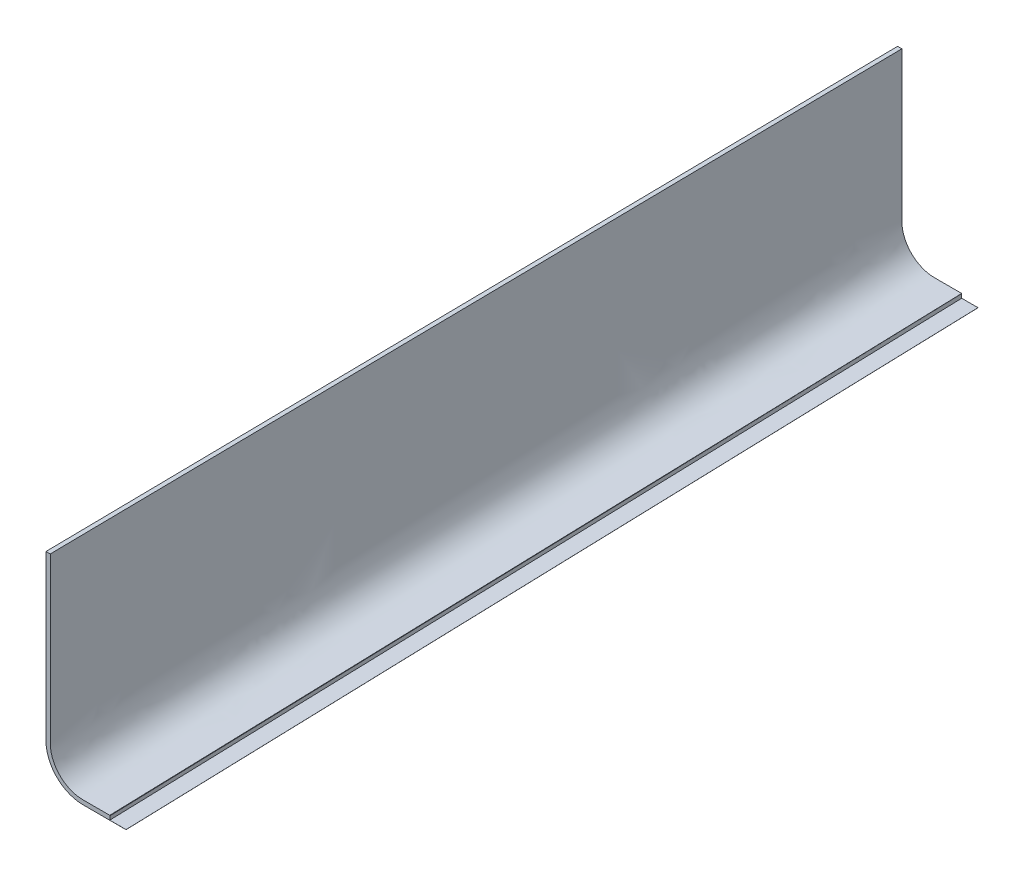
ISO-10303-21;
HEADER;
FILE_DESCRIPTION(('STEP AP214'),'2;1');
FILE_NAME('part.step','',(''),(''),'','','');
FILE_SCHEMA(('AUTOMOTIVE_DESIGN { 1 0 10303 214 1 1 1 1 }'));
ENDSEC;
DATA;
#1=APPLICATION_CONTEXT('core data for automotive mechanical design processes');
#2=APPLICATION_PROTOCOL_DEFINITION('international standard','automotive_design',2000,#1);
#3=PRODUCT_CONTEXT('',#1,'mechanical');
#4=PRODUCT('Part','Part','',(#3));
#5=PRODUCT_RELATED_PRODUCT_CATEGORY('part','',(#4));
#6=PRODUCT_DEFINITION_FORMATION('','',#4);
#7=PRODUCT_DEFINITION_CONTEXT('part definition',#1,'design');
#8=PRODUCT_DEFINITION('design','',#6,#7);
#9=PRODUCT_DEFINITION_SHAPE('','',#8);
#10=(LENGTH_UNIT() NAMED_UNIT(*) SI_UNIT(.MILLI.,.METRE.));
#11=(NAMED_UNIT(*) PLANE_ANGLE_UNIT() SI_UNIT($,.RADIAN.));
#12=(NAMED_UNIT(*) SI_UNIT($,.STERADIAN.) SOLID_ANGLE_UNIT());
#13=UNCERTAINTY_MEASURE_WITH_UNIT(LENGTH_MEASURE(1.E-05),#10,'distance_accuracy_value','');
#14=(GEOMETRIC_REPRESENTATION_CONTEXT(3) GLOBAL_UNCERTAINTY_ASSIGNED_CONTEXT((#13)) GLOBAL_UNIT_ASSIGNED_CONTEXT((#10,
#11,#12)) REPRESENTATION_CONTEXT('',''));
#15=CARTESIAN_POINT('',(0.,0.,0.));
#16=DIRECTION('',(0.,0.,1.));
#17=DIRECTION('',(1.,0.,0.));
#18=AXIS2_PLACEMENT_3D('',#15,#16,#17);
#19=CARTESIAN_POINT('',(-445.153479576773,-230.782639429531,-2052.91158045471));
#20=DIRECTION('',(0.,0.,-1.));
#21=DIRECTION('',(-1.,0.,0.));
#22=AXIS2_PLACEMENT_3D('',#19,#20,#21);
#23=PLANE('',#22);
#24=DIRECTION('',(-1.,0.,0.));
#25=VECTOR('',#24,1.);
#26=CARTESIAN_POINT('',(-521.353479576773,118.467360570469,-2052.91158045471));
#27=LINE('',#26,#25);
#28=CARTESIAN_POINT('',(-521.353479576773,118.467360570469,-2052.91158045471));
#29=VERTEX_POINT('',#28);
#30=CARTESIAN_POINT('',(-531.353479576773,118.467360570469,-2052.91158045471));
#31=VERTEX_POINT('',#30);
#32=EDGE_CURVE('E372',#29,#31,#27,.T.);
#33=ORIENTED_EDGE('',*,*,#32,.F.);
#34=DIRECTION('',(0.,-1.,0.));
#35=VECTOR('',#34,1.);
#36=CARTESIAN_POINT('',(-521.353479576773,118.467360570469,-2052.91158045471));
#37=LINE('',#36,#35);
#38=CARTESIAN_POINT('',(-521.353479576773,-230.782639429531,-2052.91158045471));
#39=VERTEX_POINT('',#38);
#40=EDGE_CURVE('E13',#29,#39,#37,.T.);
#41=ORIENTED_EDGE('',*,*,#40,.T.);
#42=CARTESIAN_POINT('',(-445.153479576773,-230.782639429531,-2052.91158045471));
#43=DIRECTION('',(0.,0.,-1.));
#44=DIRECTION('',(-1.,0.,0.));
#45=AXIS2_PLACEMENT_3D('',#42,#43,#44);
#46=CIRCLE('',#45,76.2);
#47=CARTESIAN_POINT('',(-445.153479576773,-306.982639429531,-2052.91158045471));
#48=VERTEX_POINT('',#47);
#49=EDGE_CURVE('E280',#48,#39,#46,.T.);
#50=ORIENTED_EDGE('',*,*,#49,.F.);
#51=DIRECTION('',(1.,0.,0.));
#52=VECTOR('',#51,1.);
#53=CARTESIAN_POINT('',(-445.153479576773,-306.982639429531,-2052.91158045471));
#54=LINE('',#53,#52);
#55=CARTESIAN_POINT('',(-381.356191574078,-306.982639429531,-2052.91158045471));
#56=VERTEX_POINT('',#55);
#57=EDGE_CURVE('E730',#48,#56,#54,.T.);
#58=ORIENTED_EDGE('',*,*,#57,.T.);
#59=DIRECTION('',(0.,1.,0.));
#60=VECTOR('',#59,1.);
#61=CARTESIAN_POINT('',(-381.356191574078,-316.782639429531,-2052.91158045471));
#62=LINE('',#61,#60);
#63=CARTESIAN_POINT('',(-381.356191574078,-307.844992886495,-2052.91158045471));
#64=VERTEX_POINT('',#63);
#65=EDGE_CURVE('E586',#64,#56,#62,.T.);
#66=ORIENTED_EDGE('',*,*,#65,.F.);
#67=CARTESIAN_POINT('',(-381.356191574078,-316.782639429531,-2052.91158045471));
#68=VERTEX_POINT('',#67);
#69=EDGE_CURVE('E727',#68,#64,#62,.T.);
#70=ORIENTED_EDGE('',*,*,#69,.F.);
#71=DIRECTION('',(-1.,0.,0.));
#72=VECTOR('',#71,1.);
#73=CARTESIAN_POINT('',(-343.256191574078,-316.782639429531,-2052.91158045471));
#74=LINE('',#73,#72);
#75=CARTESIAN_POINT('',(-343.256191574078,-316.782639429531,-2052.91158045471));
#76=VERTEX_POINT('',#75);
#77=EDGE_CURVE('E722',#76,#68,#74,.T.);
#78=ORIENTED_EDGE('',*,*,#77,.F.);
#79=DIRECTION('',(2.7755575615632E-13,1.,0.));
#80=VECTOR('',#79,1.);
#81=CARTESIAN_POINT('',(-343.256191574078,-316.982639429531,-2052.91158045471));
#82=LINE('',#81,#80);
#83=CARTESIAN_POINT('',(-343.256191574078,-316.982639429531,-2052.91158045471));
#84=VERTEX_POINT('',#83);
#85=EDGE_CURVE('E725',#84,#76,#82,.T.);
#86=ORIENTED_EDGE('',*,*,#85,.F.);
#87=DIRECTION('',(1.,0.,0.));
#88=VECTOR('',#87,1.);
#89=CARTESIAN_POINT('',(-364.070454388012,-316.982639429531,-2052.91158045471));
#90=LINE('',#89,#88);
#91=CARTESIAN_POINT('',(-364.070454388012,-316.982639429531,-2052.91158045471));
#92=VERTEX_POINT('',#91);
#93=EDGE_CURVE('E761',#92,#84,#90,.T.);
#94=ORIENTED_EDGE('',*,*,#93,.F.);
#95=DIRECTION('',(1.,0.,0.));
#96=VECTOR('',#95,1.);
#97=CARTESIAN_POINT('',(-445.153479576773,-316.982639429531,-2052.91158045471));
#98=LINE('',#97,#96);
#99=CARTESIAN_POINT('',(-445.153479576773,-316.982639429531,-2052.91158045471));
#100=VERTEX_POINT('',#99);
#101=EDGE_CURVE('E778',#100,#92,#98,.T.);
#102=ORIENTED_EDGE('',*,*,#101,.F.);
#103=CARTESIAN_POINT('',(-445.153479576773,-230.782639429531,-2052.91158045471));
#104=DIRECTION('',(0.,0.,-1.));
#105=DIRECTION('',(-1.,0.,0.));
#106=AXIS2_PLACEMENT_3D('',#103,#104,#105);
#107=CIRCLE('',#106,86.2);
#108=CARTESIAN_POINT('',(-531.353479576773,-230.782639429531,-2052.91158045471));
#109=VERTEX_POINT('',#108);
#110=EDGE_CURVE('E781',#100,#109,#107,.T.);
#111=ORIENTED_EDGE('',*,*,#110,.T.);
#112=DIRECTION('',(0.,-1.,0.));
#113=VECTOR('',#112,1.);
#114=CARTESIAN_POINT('',(-531.353479576773,118.467360570469,-2052.91158045471));
#115=LINE('',#114,#113);
#116=EDGE_CURVE('E574',#31,#109,#115,.T.);
#117=ORIENTED_EDGE('',*,*,#116,.F.);
#118=EDGE_LOOP('',(#33,#41,#50,#58,#66,#70,#78,#86,#94,#102,#111,#117));
#119=FACE_BOUND('',#118,.T.);
#120=ADVANCED_FACE('F269',(#119),#23,.T.);
#121=CARTESIAN_POINT('',(-383.521789204399,-230.782639429518,0.));
#122=DIRECTION('',(0.,0.,1.));
#123=DIRECTION('',(1.,0.,0.));
#124=AXIS2_PLACEMENT_3D('',#121,#122,#123);
#125=PLANE('',#124);
#126=DIRECTION('',(0.,-1.,0.));
#127=VECTOR('',#126,1.);
#128=CARTESIAN_POINT('',(-469.721789204399,152.757360570421,0.));
#129=LINE('',#128,#127);
#130=CARTESIAN_POINT('',(-469.721789204399,152.757360570421,0.));
#131=VERTEX_POINT('',#130);
#132=CARTESIAN_POINT('',(-469.721789204399,142.757360569809,0.));
#133=VERTEX_POINT('',#132);
#134=EDGE_CURVE('E490',#131,#133,#129,.T.);
#135=ORIENTED_EDGE('',*,*,#134,.T.);
#136=DIRECTION('',(0.,-1.,0.));
#137=VECTOR('',#136,1.);
#138=CARTESIAN_POINT('',(-469.721789204399,142.757360570421,0.));
#139=LINE('',#138,#137);
#140=CARTESIAN_POINT('',(-469.721789204399,-230.782639429505,0.));
#141=VERTEX_POINT('',#140);
#142=EDGE_CURVE('E482',#133,#141,#139,.T.);
#143=ORIENTED_EDGE('',*,*,#142,.T.);
#144=CARTESIAN_POINT('',(-383.521789204399,-230.782639429518,0.));
#145=DIRECTION('',(0.,0.,1.));
#146=DIRECTION('',(1.,0.,0.));
#147=AXIS2_PLACEMENT_3D('',#144,#145,#146);
#148=CIRCLE('',#147,86.2);
#149=CARTESIAN_POINT('',(-383.521794947628,-316.988202016457,0.));
#150=VERTEX_POINT('',#149);
#151=EDGE_CURVE('E489',#141,#150,#148,.T.);
#152=ORIENTED_EDGE('',*,*,#151,.T.);
#153=DIRECTION('',(0.999998000005999,-0.00199999600055312,0.));
#154=VECTOR('',#153,1.);
#155=CARTESIAN_POINT('',(-383.521789204399,-316.982639429518,0.));
#156=LINE('',#155,#154);
#157=CARTESIAN_POINT('',(-320.627654741503,-317.104976295081,0.));
#158=VERTEX_POINT('',#157);
#159=EDGE_CURVE('E494',#150,#158,#156,.T.);
#160=ORIENTED_EDGE('',*,*,#159,.T.);
#161=DIRECTION('',(-1.,0.,0.));
#162=VECTOR('',#161,1.);
#163=CARTESIAN_POINT('',(-282.527675027662,-317.108427688626,0.));
#164=LINE('',#163,#162);
#165=CARTESIAN_POINT('',(-282.527675027662,-317.108427688626,0.));
#166=VERTEX_POINT('',#165);
#167=EDGE_CURVE('E670',#166,#158,#164,.T.);
#168=ORIENTED_EDGE('',*,*,#167,.F.);
#169=DIRECTION('',(0.,1.,0.));
#170=VECTOR('',#169,1.);
#171=CARTESIAN_POINT('',(-282.527675027662,-317.108427688626,0.));
#172=LINE('',#171,#170);
#173=CARTESIAN_POINT('',(-282.527675027662,-316.908427688626,0.));
#174=VERTEX_POINT('',#173);
#175=EDGE_CURVE('E673',#166,#174,#172,.T.);
#176=ORIENTED_EDGE('',*,*,#175,.T.);
#177=DIRECTION('',(-1.,0.,0.));
#178=VECTOR('',#177,1.);
#179=CARTESIAN_POINT('',(-282.527675027662,-316.908427688626,0.));
#180=LINE('',#179,#178);
#181=CARTESIAN_POINT('',(-320.627659667512,-316.908427688626,0.));
#182=VERTEX_POINT('',#181);
#183=EDGE_CURVE('E674',#174,#182,#180,.T.);
#184=ORIENTED_EDGE('',*,*,#183,.T.);
#185=DIRECTION('',(-0.0652485640375134,-0.997869041954425,0.));
#186=VECTOR('',#185,1.);
#187=CARTESIAN_POINT('',(-320.021789204393,-307.642639429531,0.));
#188=LINE('',#187,#186);
#189=CARTESIAN_POINT('',(-320.021789204393,-307.642639429531,0.));
#190=VERTEX_POINT('',#189);
#191=EDGE_CURVE('E632',#190,#182,#188,.T.);
#192=ORIENTED_EDGE('',*,*,#191,.F.);
#193=DIRECTION('',(-0.676252409146983,0.73666999336399,0.));
#194=VECTOR('',#193,1.);
#195=CARTESIAN_POINT('',(-320.021789204393,-307.642639429531,0.));
#196=LINE('',#195,#194);
#197=CARTESIAN_POINT('',(-320.627659667512,-306.982639429518,0.));
#198=VERTEX_POINT('',#197);
#199=EDGE_CURVE('E930',#190,#198,#196,.T.);
#200=ORIENTED_EDGE('',*,*,#199,.T.);
#201=DIRECTION('',(1.,0.,0.));
#202=VECTOR('',#201,1.);
#203=CARTESIAN_POINT('',(-383.521789204399,-306.982639429518,0.));
#204=LINE('',#203,#202);
#205=CARTESIAN_POINT('',(-383.521789204479,-306.982639429518,0.));
#206=VERTEX_POINT('',#205);
#207=EDGE_CURVE('E879',#206,#198,#204,.T.);
#208=ORIENTED_EDGE('',*,*,#207,.F.);
#209=CARTESIAN_POINT('',(-383.521789204399,-230.782639429518,0.));
#210=DIRECTION('',(0.,0.,1.));
#211=DIRECTION('',(1.,0.,0.));
#212=AXIS2_PLACEMENT_3D('',#209,#210,#211);
#213=CIRCLE('',#212,76.2000000000001);
#214=CARTESIAN_POINT('',(-459.721789204399,-230.782639429514,0.));
#215=VERTEX_POINT('',#214);
#216=EDGE_CURVE('E391',#215,#206,#213,.T.);
#217=ORIENTED_EDGE('',*,*,#216,.F.);
#218=DIRECTION('',(0.,-1.,0.));
#219=VECTOR('',#218,1.);
#220=CARTESIAN_POINT('',(-459.721789204399,152.757360570421,0.));
#221=LINE('',#220,#219);
#222=CARTESIAN_POINT('',(-459.721789204399,152.757360570421,0.));
#223=VERTEX_POINT('',#222);
#224=EDGE_CURVE('E366',#223,#215,#221,.T.);
#225=ORIENTED_EDGE('',*,*,#224,.F.);
#226=DIRECTION('',(-1.,0.,0.));
#227=VECTOR('',#226,1.);
#228=CARTESIAN_POINT('',(-459.721789204399,152.757360570421,0.));
#229=LINE('',#228,#227);
#230=EDGE_CURVE('E376',#223,#131,#229,.T.);
#231=ORIENTED_EDGE('',*,*,#230,.T.);
#232=EDGE_LOOP('',(#135,#143,#152,#160,#168,#176,#184,#192,#200,#208,#217,#225,#231));
#233=FACE_BOUND('',#232,.T.);
#234=ADVANCED_FACE('F389',(#233),#125,.T.);
#235=CARTESIAN_POINT('',(-469.721789204399,152.757360570421,0.));
#236=DIRECTION('',(0.,0.99986053230512,-0.0167007765843963));
#237=DIRECTION('',(1.,0.,0.));
#238=AXIS2_PLACEMENT_3D('',#235,#236,#237);
#239=PLANE('',#238);
#240=ORIENTED_EDGE('',*,*,#230,.F.);
#241=CARTESIAN_POINT('',(-459.721789204399,152.757360570421,0.));
#242=CARTESIAN_POINT('',(-480.26568599519,141.327360570437,-684.303860151571));
#243=CARTESIAN_POINT('',(-500.809582785982,129.897360570453,-1368.60772030314));
#244=CARTESIAN_POINT('',(-521.353479576773,118.467360570469,-2052.91158045471));
#245=B_SPLINE_CURVE_WITH_KNOTS('',3,(#241,#242,#243,#244),.UNSPECIFIED.,.F.,.F.,(4,4),(0.,1.),.UNSPECIFIED.);
#246=EDGE_CURVE('E296',#223,#29,#245,.T.);
#247=ORIENTED_EDGE('',*,*,#246,.T.);
#248=ORIENTED_EDGE('',*,*,#32,.T.);
#249=CARTESIAN_POINT('',(-469.721789204399,152.757360570421,0.));
#250=CARTESIAN_POINT('',(-490.26568599519,141.327360570437,-684.303860151571));
#251=CARTESIAN_POINT('',(-510.809582785982,129.897360570453,-1368.60772030314));
#252=CARTESIAN_POINT('',(-531.353479576773,118.467360570469,-2052.91158045471));
#253=B_SPLINE_CURVE_WITH_KNOTS('',3,(#249,#250,#251,#252),.UNSPECIFIED.,.F.,.F.,(4,4),(0.,1.),.UNSPECIFIED.);
#254=EDGE_CURVE('E373',#131,#31,#253,.T.);
#255=ORIENTED_EDGE('',*,*,#254,.F.);
#256=EDGE_LOOP('',(#240,#247,#248,#255));
#257=FACE_BOUND('',#256,.T.);
#258=ADVANCED_FACE('F378',(#257),#239,.T.);
#259=CARTESIAN_POINT('',(-282.527675027662,-317.108427688626,0.));
#260=CARTESIAN_POINT('',(-302.770513876468,-317.066498268928,-684.303860151571));
#261=CARTESIAN_POINT('',(-323.013352725273,-317.024568849229,-1368.60772030314));
#262=CARTESIAN_POINT('',(-343.256191574078,-316.982639429531,-2052.91158045471));
#263=CARTESIAN_POINT('',(-285.697641302843,-317.108427688626,0.));
#264=CARTESIAN_POINT('',(-305.463585658995,-317.066498268927,-684.303860151571));
#265=CARTESIAN_POINT('',(-325.229530015147,-317.024568849229,-1368.60772030314));
#266=CARTESIAN_POINT('',(-344.9954743713,-316.982639429531,-2052.91158045471));
#267=CARTESIAN_POINT('',(-292.576849740251,-317.108427688626,0.));
#268=CARTESIAN_POINT('',(-311.131651829535,-317.066498268928,-684.303860151572));
#269=CARTESIAN_POINT('',(-329.686453918819,-317.024568849229,-1368.60772030314));
#270=CARTESIAN_POINT('',(-348.241256008104,-316.982639429531,-2052.91158045472));
#271=CARTESIAN_POINT('',(-303.369400639009,-317.108427688626,0.));
#272=CARTESIAN_POINT('',(-319.884841536408,-317.066498268928,-684.30386015157));
#273=CARTESIAN_POINT('',(-336.400282433806,-317.024568849229,-1368.60772030314));
#274=CARTESIAN_POINT('',(-352.915723331205,-316.982639429531,-2052.91158045471));
#275=CARTESIAN_POINT('',(-312.916905601412,-317.108427688626,0.));
#276=CARTESIAN_POINT('',(-327.905516792665,-317.066498268928,-684.303860151573));
#277=CARTESIAN_POINT('',(-342.894127983917,-317.024568849229,-1368.60772030315));
#278=CARTESIAN_POINT('',(-357.882739175169,-316.982639429531,-2052.91158045472));
#279=CARTESIAN_POINT('',(-318.204006148451,-317.108427688626,0.));
#280=CARTESIAN_POINT('',(-332.677713958313,-317.066498268928,-684.303860151571));
#281=CARTESIAN_POINT('',(-347.151421768176,-317.024568849229,-1368.60772030314));
#282=CARTESIAN_POINT('',(-361.625129578038,-316.982639429531,-2052.91158045471));
#283=CARTESIAN_POINT('',(-326.62018082716,-317.096442646303,0.));
#284=CARTESIAN_POINT('',(-341.11897729975,-317.058508240712,-684.303860151571));
#285=CARTESIAN_POINT('',(-355.617773772339,-317.020573835122,-1368.60772030314));
#286=CARTESIAN_POINT('',(-370.116570244929,-316.982639429531,-2052.91158045471));
#287=CARTESIAN_POINT('',(-337.385924064454,-317.074911159823,0.));
#288=CARTESIAN_POINT('',(-352.58486759045,-317.044153916393,-684.303860151571));
#289=CARTESIAN_POINT('',(-367.783811116446,-317.013396672962,-1368.60772030314));
#290=CARTESIAN_POINT('',(-382.982754642442,-316.982639429531,-2052.91158045471));
#291=CARTESIAN_POINT('',(-352.369882640405,-317.044943242663,0.));
#292=CARTESIAN_POINT('',(-369.621517711926,-317.024175304952,-684.303860151571));
#293=CARTESIAN_POINT('',(-386.873152783447,-317.003407367241,-1368.60772030314));
#294=CARTESIAN_POINT('',(-404.124787854967,-316.982639429531,-2052.91158045471));
#295=CARTESIAN_POINT('',(-367.243954903688,-317.015195098129,0.));
#296=CARTESIAN_POINT('',(-386.684687497904,-317.004343208596,-684.303860151571));
#297=CARTESIAN_POINT('',(-406.125420092119,-316.993491319063,-1368.60772030314));
#298=CARTESIAN_POINT('',(-425.566152686335,-316.982639429531,-2052.91158045471));
#299=CARTESIAN_POINT('',(-377.772711680761,-316.994137584569,0.));
#300=CARTESIAN_POINT('',(-398.140826369264,-316.990304866223,-684.303860151571));
#301=CARTESIAN_POINT('',(-418.508941057767,-316.986472147877,-1368.60772030314));
#302=CARTESIAN_POINT('',(-438.87705574627,-316.982639429531,-2052.91158045471));
#303=CARTESIAN_POINT('',(-388.909615437399,-316.982639429518,0.));
#304=CARTESIAN_POINT('',(-409.618244895995,-316.982639429522,-684.303860151571));
#305=CARTESIAN_POINT('',(-430.326874354591,-316.982639429527,-1368.60772030314));
#306=CARTESIAN_POINT('',(-451.035503813186,-316.982639429531,-2052.91158045471));
#307=CARTESIAN_POINT('',(-399.760775558192,-315.96946035865,0.));
#308=CARTESIAN_POINT('',(-420.747864585682,-315.904732703993,-684.30386015157));
#309=CARTESIAN_POINT('',(-441.734953613172,-315.840005049336,-1368.60772030314));
#310=CARTESIAN_POINT('',(-462.722042640662,-315.77527739468,-2052.91158045471));
#311=CARTESIAN_POINT('',(-415.665679093124,-311.340510534376,0.));
#312=CARTESIAN_POINT('',(-436.887197428043,-311.075246025188,-684.303860151573));
#313=CARTESIAN_POINT('',(-458.108715762962,-310.809981516,-1368.60772030315));
#314=CARTESIAN_POINT('',(-479.330234097881,-310.544717006813,-2052.91158045472));
#315=CARTESIAN_POINT('',(-430.573694034692,-303.660229241234,0.));
#316=CARTESIAN_POINT('',(-451.849796552725,-303.17842871892,-684.303860151569));
#317=CARTESIAN_POINT('',(-473.125899070759,-302.696628196607,-1368.60772030314));
#318=CARTESIAN_POINT('',(-494.402001588792,-302.214827674294,-2052.91158045471));
#319=CARTESIAN_POINT('',(-443.863702089116,-293.120026681974,0.));
#320=CARTESIAN_POINT('',(-465.045919631966,-292.479753700611,-684.303860151573));
#321=CARTESIAN_POINT('',(-486.228137174817,-291.839480719248,-1368.60772030315));
#322=CARTESIAN_POINT('',(-507.410354717667,-291.199207737884,-2052.91158045472));
#323=CARTESIAN_POINT('',(-454.949248486127,-280.048650099816,0.));
#324=CARTESIAN_POINT('',(-475.942112838937,-279.361559815593,-684.303860151569));
#325=CARTESIAN_POINT('',(-496.934977191746,-278.67446953137,-1368.60772030314));
#326=CARTESIAN_POINT('',(-517.927841544555,-277.987379247147,-2052.91158045471));
#327=CARTESIAN_POINT('',(-463.311236697098,-264.90544229162,0.));
#328=CARTESIAN_POINT('',(-484.085148088738,-264.31134710688,-684.303860151573));
#329=CARTESIAN_POINT('',(-504.859059480378,-263.71725192214,-1368.60772030315));
#330=CARTESIAN_POINT('',(-525.632970872018,-263.1231567374,-2052.91158045472));
#331=CARTESIAN_POINT('',(-468.531236821943,-248.266005012165,0.));
#332=CARTESIAN_POINT('',(-489.125829294062,-247.905562356473,-684.30386015157));
#333=CARTESIAN_POINT('',(-509.720421766181,-247.545119700781,-1368.60772030314));
#334=CARTESIAN_POINT('',(-530.3150142383,-247.18467704509,-2052.91158045471));
#335=CARTESIAN_POINT('',(-469.721789204399,-236.621288969974,0.));
#336=CARTESIAN_POINT('',(-490.26568599519,-236.493581515715,-684.303860151571));
#337=CARTESIAN_POINT('',(-510.809582785982,-236.365874061455,-1368.60772030314));
#338=CARTESIAN_POINT('',(-531.353479576773,-236.238166607195,-2052.91158045471));
#339=CARTESIAN_POINT('',(-469.721789204399,-200.048051638939,0.));
#340=CARTESIAN_POINT('',(-490.26568599519,-200.720302291666,-684.303860151571));
#341=CARTESIAN_POINT('',(-510.809582785982,-201.392552944392,-1368.60772030314));
#342=CARTESIAN_POINT('',(-531.353479576773,-202.064803597119,-2052.91158045471));
#343=CARTESIAN_POINT('',(-469.721789204399,-138.193798752856,0.));
#344=CARTESIAN_POINT('',(-490.265685995191,-140.465896537066,-684.303860151572));
#345=CARTESIAN_POINT('',(-510.809582785982,-142.737994321277,-1368.60772030314));
#346=CARTESIAN_POINT('',(-531.353479576774,-145.010092105487,-2052.91158045472));
#347=CARTESIAN_POINT('',(-469.721789204398,-44.6637714033891,0.));
#348=CARTESIAN_POINT('',(-490.265685995189,-49.814518135901,-684.303860151571));
#349=CARTESIAN_POINT('',(-510.809582785981,-54.9652648684129,-1368.60772030314));
#350=CARTESIAN_POINT('',(-531.353479576772,-60.1160116009249,-2052.91158045471));
#351=CARTESIAN_POINT('',(-469.721789204399,49.1723297793905,0.));
#352=CARTESIAN_POINT('',(-490.265685995191,40.9510954872967,-684.303860151571));
#353=CARTESIAN_POINT('',(-510.809582785982,32.7298611952029,-1368.60772030314));
#354=CARTESIAN_POINT('',(-531.353479576774,24.5086269031091,-2052.91158045471));
#355=CARTESIAN_POINT('',(-469.721789204399,111.629027237092,0.));
#356=CARTESIAN_POINT('',(-490.26568599519,101.424706045053,-684.303860151571));
#357=CARTESIAN_POINT('',(-510.809582785982,91.2203848530143,-1368.60772030314));
#358=CARTESIAN_POINT('',(-531.353479576773,81.0160636609753,-2052.91158045471));
#359=CARTESIAN_POINT('',(-469.721789204399,143.590693903754,0.));
#360=CARTESIAN_POINT('',(-490.26568599519,132.433872711717,-684.303860151571));
#361=CARTESIAN_POINT('',(-510.809582785982,121.277051519679,-1368.60772030314));
#362=CARTESIAN_POINT('',(-531.353479576773,110.120230327642,-2052.91158045471));
#363=CARTESIAN_POINT('',(-469.721789204398,145.267452631782,0.));
#364=CARTESIAN_POINT('',(-490.26568599519,134.054601088933,-684.303860151571));
#365=CARTESIAN_POINT('',(-510.809582785982,122.841749546084,-1368.60772030314));
#366=CARTESIAN_POINT('',(-531.353479576774,111.628898003236,-2052.91158045471));
#367=CARTESIAN_POINT('',(-469.721789204399,147.790259303955,0.));
#368=CARTESIAN_POINT('',(-490.26568599519,136.488584638718,-684.303860151571));
#369=CARTESIAN_POINT('',(-510.809582785982,125.186909973481,-1368.60772030314));
#370=CARTESIAN_POINT('',(-531.353479576773,113.885235308245,-2052.91158045471));
#371=CARTESIAN_POINT('',(-469.721789204398,150.297349096639,0.));
#372=CARTESIAN_POINT('',(-490.26568599519,138.916426140703,-684.303860151571));
#373=CARTESIAN_POINT('',(-510.809582785982,127.535503184767,-1368.60772030314));
#374=CARTESIAN_POINT('',(-531.353479576774,116.154580228832,-2052.91158045471));
#375=CARTESIAN_POINT('',(-469.721789204399,151.943619570317,0.));
#376=CARTESIAN_POINT('',(-490.26568599519,140.525744850136,-684.303860151571));
#377=CARTESIAN_POINT('',(-510.809582785982,129.107870129955,-1368.60772030314));
#378=CARTESIAN_POINT('',(-531.353479576773,117.689995409774,-2052.91158045471));
#379=CARTESIAN_POINT('',(-469.721789204399,152.757360570421,0.));
#380=CARTESIAN_POINT('',(-490.26568599519,141.327360570437,-684.303860151571));
#381=CARTESIAN_POINT('',(-510.809582785982,129.897360570453,-1368.60772030314));
#382=CARTESIAN_POINT('',(-531.353479576773,118.467360570469,-2052.91158045471));
#383=B_SPLINE_SURFACE_WITH_KNOTS('',3,3,((#259,#260,#261,#262),(#263,#264,#265,#266),(#267,#268,
#269,#270),(#271,#272,#273,#274),(#275,#276,#277,#278),(#279,#280,#281,#282),(#283,#284,#285,
#286),(#287,#288,#289,#290),(#291,#292,#293,#294),(#295,#296,#297,#298),(#299,#300,#301,#302),
(#303,#304,#305,#306),(#307,#308,#309,#310),(#311,#312,#313,#314),(#315,#316,#317,#318),(#319,
#320,#321,#322),(#323,#324,#325,#326),(#327,#328,#329,#330),(#331,#332,#333,#334),(#335,#336,
#337,#338),(#339,#340,#341,#342),(#343,#344,#345,#346),(#347,#348,#349,#350),(#351,#352,#353,
#354),(#355,#356,#357,#358),(#359,#360,#361,#362),(#363,#364,#365,#366),(#367,#368,#369,#370),
(#371,#372,#373,#374),(#375,#376,#377,#378),(#379,#380,#381,#382)),.UNSPECIFIED.,.F.,.F.,.F.,(4,
1,1,1,2,1,1,1,2,1,1,1,1,1,1,1,2,1,1,1,2,1,1,1,4),(4,4),(0.493585921440686,0.499622397832213,
0.505658874223741,0.511695350615268,0.517731827006795,0.532657138966114,0.547582450925434,
0.562507762884754,0.577433074844074,0.591420506162098,0.605407937480122,0.619395368798146,
0.633382800116169,0.647370231434193,0.661357662752217,0.675345094070241,0.689332525388265,
0.762962211505326,0.836591897622386,0.910221583739447,0.983851269856507,0.985822402429112,
0.987793535001716,0.989764667574321,0.991735800146926),(0.,1.),.UNSPECIFIED.);
#384=CARTESIAN_POINT('',(-282.527675027662,-317.108427688626,0.));
#385=CARTESIAN_POINT('',(-302.770513876468,-317.066498268928,-684.303860151571));
#386=CARTESIAN_POINT('',(-323.013352725273,-317.024568849229,-1368.60772030314));
#387=CARTESIAN_POINT('',(-343.256191574078,-316.982639429531,-2052.91158045471));
#388=B_SPLINE_CURVE_WITH_KNOTS('',3,(#384,#385,#386,#387),.UNSPECIFIED.,.F.,.F.,(4,4),(0.,1.),.UNSPECIFIED.);
#389=EDGE_CURVE('E653',#166,#84,#388,.T.);
#390=ORIENTED_EDGE('',*,*,#167,.T.);
#391=ORIENTED_EDGE('',*,*,#159,.F.);
#392=ORIENTED_EDGE('',*,*,#151,.F.);
#393=ORIENTED_EDGE('',*,*,#142,.F.);
#394=ORIENTED_EDGE('',*,*,#134,.F.);
#395=ORIENTED_EDGE('',*,*,#254,.T.);
#396=ORIENTED_EDGE('',*,*,#116,.T.);
#397=ORIENTED_EDGE('',*,*,#110,.F.);
#398=ORIENTED_EDGE('',*,*,#101,.T.);
#399=ORIENTED_EDGE('',*,*,#93,.T.);
#400=ORIENTED_EDGE('',*,*,#389,.F.);
#401=EDGE_LOOP('',(#390,#391,#392,#393,#394,#395,#396,#397,#398,#399,#400));
#402=FACE_BOUND('',#401,.T.);
#403=ADVANCED_FACE('F501',(#402),#383,.T.);
#404=CARTESIAN_POINT('',(-282.527675027662,-316.908427688626,0.));
#405=DIRECTION('',(0.999562749872818,0.,-0.0295687177045329));
#406=DIRECTION('',(0.,-1.,0.));
#407=AXIS2_PLACEMENT_3D('',#404,#405,#406);
#408=PLANE('',#407);
#409=ORIENTED_EDGE('',*,*,#175,.F.);
#410=ORIENTED_EDGE('',*,*,#389,.T.);
#411=ORIENTED_EDGE('',*,*,#85,.T.);
#412=CARTESIAN_POINT('',(-282.527675027662,-316.908427688626,0.));
#413=CARTESIAN_POINT('',(-302.770513876468,-316.866498268928,-684.303860151571));
#414=CARTESIAN_POINT('',(-323.013352725273,-316.824568849229,-1368.60772030314));
#415=CARTESIAN_POINT('',(-343.256191574078,-316.782639429531,-2052.91158045471));
#416=B_SPLINE_CURVE_WITH_KNOTS('',3,(#412,#413,#414,#415),.UNSPECIFIED.,.F.,.F.,(4,4),(0.,1.),.UNSPECIFIED.);
#417=EDGE_CURVE('E643',#174,#76,#416,.T.);
#418=ORIENTED_EDGE('',*,*,#417,.F.);
#419=EDGE_LOOP('',(#409,#410,#411,#418));
#420=FACE_BOUND('',#419,.T.);
#421=ADVANCED_FACE('F523',(#420),#408,.T.);
#422=CARTESIAN_POINT('',(-320.627659667512,-316.908427688626,0.));
#423=DIRECTION('',(0.,0.999999998122804,6.12731011195564E-05));
#424=DIRECTION('',(1.,0.,0.));
#425=AXIS2_PLACEMENT_3D('',#422,#423,#424);
#426=PLANE('',#425);
#427=ORIENTED_EDGE('',*,*,#183,.F.);
#428=ORIENTED_EDGE('',*,*,#417,.T.);
#429=ORIENTED_EDGE('',*,*,#77,.T.);
#430=CARTESIAN_POINT('',(-320.627659667512,-316.908427688626,0.));
#431=CARTESIAN_POINT('',(-340.870503636367,-316.866498268928,-684.303860151571));
#432=CARTESIAN_POINT('',(-361.113347605223,-316.824568849229,-1368.60772030314));
#433=CARTESIAN_POINT('',(-381.356191574078,-316.782639429531,-2052.91158045471));
#434=B_SPLINE_CURVE_WITH_KNOTS('',3,(#430,#431,#432,#433),.UNSPECIFIED.,.F.,.F.,(4,4),(0.,1.),.UNSPECIFIED.);
#435=EDGE_CURVE('E620',#182,#68,#434,.T.);
#436=ORIENTED_EDGE('',*,*,#435,.F.);
#437=EDGE_LOOP('',(#427,#428,#429,#436));
#438=FACE_BOUND('',#437,.T.);
#439=ADVANCED_FACE('F271',(#438),#426,.T.);
#440=CARTESIAN_POINT('',(-320.021789204393,-307.642639429531,0.));
#441=CARTESIAN_POINT('',(-340.466589994288,-307.710090581852,-684.303860151571));
#442=CARTESIAN_POINT('',(-360.911390784183,-307.777541734173,-1368.60772030314));
#443=CARTESIAN_POINT('',(-381.356191574078,-307.844992886495,-2052.91158045471));
#444=CARTESIAN_POINT('',(-320.072278409653,-308.414788451122,0.));
#445=CARTESIAN_POINT('',(-340.500249464461,-308.473124555775,-684.303860151571));
#446=CARTESIAN_POINT('',(-360.928220519269,-308.531460660428,-1368.60772030314));
#447=CARTESIAN_POINT('',(-381.356191574078,-308.589796765081,-2052.91158045471));
#448=CARTESIAN_POINT('',(-320.173256820172,-309.959086494304,0.));
#449=CARTESIAN_POINT('',(-340.567568404808,-309.999192503621,-684.303860151571));
#450=CARTESIAN_POINT('',(-360.961879989443,-310.039298512938,-1368.60772030314));
#451=CARTESIAN_POINT('',(-381.356191574078,-310.079404522254,-2052.91158045471));
#452=CARTESIAN_POINT('',(-320.324724435952,-312.275533559079,0.));
#453=CARTESIAN_POINT('',(-340.668546815327,-312.28829442539,-684.303860151571));
#454=CARTESIAN_POINT('',(-361.012369194703,-312.301055291701,-1368.60772030314));
#455=CARTESIAN_POINT('',(-381.356191574078,-312.313816158012,-2052.91158045471));
#456=CARTESIAN_POINT('',(-320.476192051732,-314.591980623852,0.));
#457=CARTESIAN_POINT('',(-340.769525225848,-314.577396347159,-684.303860151571));
#458=CARTESIAN_POINT('',(-361.062858399963,-314.562812070465,-1368.60772030314));
#459=CARTESIAN_POINT('',(-381.356191574078,-314.548227793772,-2052.91158045471));
#460=CARTESIAN_POINT('',(-320.577170462252,-316.136278667035,0.));
#461=CARTESIAN_POINT('',(-340.836844166194,-316.103464295005,-684.303860151571));
#462=CARTESIAN_POINT('',(-361.096517870136,-316.070649922975,-1368.60772030314));
#463=CARTESIAN_POINT('',(-381.356191574078,-316.037835550945,-2052.91158045471));
#464=CARTESIAN_POINT('',(-320.627659667512,-316.908427688626,0.));
#465=CARTESIAN_POINT('',(-340.870503636367,-316.866498268928,-684.303860151571));
#466=CARTESIAN_POINT('',(-361.113347605223,-316.824568849229,-1368.60772030314));
#467=CARTESIAN_POINT('',(-381.356191574078,-316.782639429531,-2052.91158045471));
#468=B_SPLINE_SURFACE_WITH_KNOTS('',3,3,((#440,#441,#442,#443),(#444,#445,#446,#447),(#448,#449,
#450,#451),(#452,#453,#454,#455),(#456,#457,#458,#459),(#460,#461,#462,#463),(#464,#465,#466,
#467)),.UNSPECIFIED.,.F.,.F.,.F.,(4,1,1,1,4),(4,4),(0.454408011132249,0.456289518892785,
0.45817102665332,0.460052534413856,0.461934042174391),(0.,1.),.UNSPECIFIED.);
#469=CARTESIAN_POINT('',(-320.021789204393,-307.642639429531,0.));
#470=CARTESIAN_POINT('',(-340.466589994288,-307.710090581852,-684.303860151571));
#471=CARTESIAN_POINT('',(-360.911390784183,-307.777541734173,-1368.60772030314));
#472=CARTESIAN_POINT('',(-381.356191574078,-307.844992886495,-2052.91158045471));
#473=B_SPLINE_CURVE_WITH_KNOTS('',3,(#469,#470,#471,#472),.UNSPECIFIED.,.F.,.F.,(4,4),(0.,1.),.UNSPECIFIED.);
#474=EDGE_CURVE('E288',#190,#64,#473,.T.);
#475=ORIENTED_EDGE('',*,*,#191,.T.);
#476=ORIENTED_EDGE('',*,*,#435,.T.);
#477=ORIENTED_EDGE('',*,*,#69,.T.);
#478=ORIENTED_EDGE('',*,*,#474,.F.);
#479=EDGE_LOOP('',(#475,#476,#477,#478));
#480=FACE_BOUND('',#479,.T.);
#481=ADVANCED_FACE('F524',(#480),#468,.T.);
#482=CARTESIAN_POINT('',(-320.627659667512,-306.982639429518,0.));
#483=CARTESIAN_POINT('',(-340.870503636367,-306.982639429522,-684.303860151571));
#484=CARTESIAN_POINT('',(-361.113347605223,-306.982639429527,-1368.60772030314));
#485=CARTESIAN_POINT('',(-381.356191574078,-306.982639429531,-2052.91158045471));
#486=CARTESIAN_POINT('',(-320.577170462252,-307.037639429519,0.));
#487=CARTESIAN_POINT('',(-340.836844166194,-307.043260358883,-684.303860151571));
#488=CARTESIAN_POINT('',(-361.096517870136,-307.048881288247,-1368.60772030314));
#489=CARTESIAN_POINT('',(-381.356191574078,-307.054502217611,-2052.91158045471));
#490=CARTESIAN_POINT('',(-320.476192051732,-307.147639429521,0.));
#491=CARTESIAN_POINT('',(-340.769525225847,-307.164502217605,-684.303860151571));
#492=CARTESIAN_POINT('',(-361.062858399962,-307.181365005688,-1368.60772030314));
#493=CARTESIAN_POINT('',(-381.356191574077,-307.198227793772,-2052.91158045471));
#494=CARTESIAN_POINT('',(-320.324724435952,-307.312639429525,0.));
#495=CARTESIAN_POINT('',(-340.668546815327,-307.346365005688,-684.303860151571));
#496=CARTESIAN_POINT('',(-361.012369194703,-307.38009058185,-1368.60772030314));
#497=CARTESIAN_POINT('',(-381.356191574078,-307.413816158012,-2052.91158045471));
#498=CARTESIAN_POINT('',(-320.173256820173,-307.477639429527,0.));
#499=CARTESIAN_POINT('',(-340.567568404808,-307.52822779377,-684.303860151571));
#500=CARTESIAN_POINT('',(-360.961879989443,-307.578816158012,-1368.60772030314));
#501=CARTESIAN_POINT('',(-381.356191574077,-307.629404522254,-2052.91158045471));
#502=CARTESIAN_POINT('',(-320.072278409653,-307.58763942953,0.));
#503=CARTESIAN_POINT('',(-340.500249464461,-307.649469652491,-684.303860151571));
#504=CARTESIAN_POINT('',(-360.928220519269,-307.711299875453,-1368.60772030314));
#505=CARTESIAN_POINT('',(-381.356191574078,-307.773130098414,-2052.91158045471));
#506=CARTESIAN_POINT('',(-320.021789204393,-307.642639429531,0.));
#507=CARTESIAN_POINT('',(-340.466589994288,-307.710090581852,-684.303860151571));
#508=CARTESIAN_POINT('',(-360.911390784183,-307.777541734173,-1368.60772030314));
#509=CARTESIAN_POINT('',(-381.356191574078,-307.844992886495,-2052.91158045471));
#510=B_SPLINE_SURFACE_WITH_KNOTS('',3,3,((#482,#483,#484,#485),(#486,#487,#488,#489),(#490,#491,
#492,#493),(#494,#495,#496,#497),(#498,#499,#500,#501),(#502,#503,#504,#505),(#506,#507,#508,
#509)),.UNSPECIFIED.,.F.,.F.,.F.,(4,1,1,1,4),(4,4),(0.453681858128195,0.453863396379208,
0.454044934630222,0.454226472881236,0.454408011132249),(0.,1.),.UNSPECIFIED.);
#511=CARTESIAN_POINT('',(-320.627659667512,-306.982639429518,0.));
#512=CARTESIAN_POINT('',(-340.870503636367,-306.982639429522,-684.303860151571));
#513=CARTESIAN_POINT('',(-361.113347605223,-306.982639429527,-1368.60772030314));
#514=CARTESIAN_POINT('',(-381.356191574078,-306.982639429531,-2052.91158045471));
#515=B_SPLINE_CURVE_WITH_KNOTS('',3,(#511,#512,#513,#514),.UNSPECIFIED.,.F.,.F.,(4,4),(0.,1.),.UNSPECIFIED.);
#516=EDGE_CURVE('E384',#198,#56,#515,.T.);
#517=ORIENTED_EDGE('',*,*,#199,.F.);
#518=ORIENTED_EDGE('',*,*,#474,.T.);
#519=ORIENTED_EDGE('',*,*,#65,.T.);
#520=ORIENTED_EDGE('',*,*,#516,.F.);
#521=EDGE_LOOP('',(#517,#518,#519,#520));
#522=FACE_BOUND('',#521,.T.);
#523=ADVANCED_FACE('F592',(#522),#510,.T.);
#524=CARTESIAN_POINT('',(-459.721789204399,152.757360570421,0.));
#525=CARTESIAN_POINT('',(-480.26568599519,141.327360570437,-684.303860151571));
#526=CARTESIAN_POINT('',(-500.809582785982,129.897360570453,-1368.60772030314));
#527=CARTESIAN_POINT('',(-521.353479576773,118.467360570469,-2052.91158045471));
#528=CARTESIAN_POINT('',(-459.721789204399,120.834754548972,0.));
#529=CARTESIAN_POINT('',(-480.26568599519,110.331916684539,-684.303860151571));
#530=CARTESIAN_POINT('',(-500.809582785982,99.8290788201055,-1368.60772030314));
#531=CARTESIAN_POINT('',(-521.353479576773,89.3262409556722,-2052.91158045471));
#532=CARTESIAN_POINT('',(-459.721789204398,56.7675087956392,0.));
#533=CARTESIAN_POINT('',(-480.26568599519,48.2617468958402,-684.303860151571));
#534=CARTESIAN_POINT('',(-500.809582785982,39.7559849960412,-1368.60772030314));
#535=CARTESIAN_POINT('',(-521.353479576774,31.2502230962422,-2052.91158045471));
#536=CARTESIAN_POINT('',(-459.721789204398,-39.546467728487,0.));
#537=CARTESIAN_POINT('',(-480.26568599519,-44.920982469301,-684.303860151571));
#538=CARTESIAN_POINT('',(-500.809582785981,-50.2954972101149,-1368.60772030314));
#539=CARTESIAN_POINT('',(-521.353479576773,-55.6700119509289,-2052.91158045471));
#540=CARTESIAN_POINT('',(-459.721789204399,-135.609553741478,0.));
#541=CARTESIAN_POINT('',(-480.26568599519,-138.010115645289,-684.303860151571));
#542=CARTESIAN_POINT('',(-500.809582785982,-140.410677549099,-1368.60772030314));
#543=CARTESIAN_POINT('',(-521.353479576774,-142.811239452909,-2052.91158045471));
#544=CARTESIAN_POINT('',(-459.721789204399,-199.182897096263,0.));
#545=CARTESIAN_POINT('',(-480.26568599519,-199.900623972316,-684.303860151571));
#546=CARTESIAN_POINT('',(-500.809582785982,-200.618350848368,-1368.60772030314));
#547=CARTESIAN_POINT('',(-521.353479576773,-201.336077724421,-2052.91158045471));
#548=CARTESIAN_POINT('',(-459.721789204399,-235.950879900168,0.));
#549=CARTESIAN_POINT('',(-480.26568599519,-235.833493338961,-684.303860151571));
#550=CARTESIAN_POINT('',(-500.809582785982,-235.716106777754,-1368.60772030314));
#551=CARTESIAN_POINT('',(-521.353479576773,-235.598720216547,-2052.91158045471));
#552=CARTESIAN_POINT('',(-458.668415337257,-246.192237030666,0.));
#553=CARTESIAN_POINT('',(-479.258004862492,-245.897918808235,-684.30386015157));
#554=CARTESIAN_POINT('',(-499.847594387727,-245.603600585803,-1368.60772030314));
#555=CARTESIAN_POINT('',(-520.437183912962,-245.309282363371,-2052.91158045471));
#556=CARTESIAN_POINT('',(-454.133881721754,-260.723369837382,0.));
#557=CARTESIAN_POINT('',(-474.836685264834,-260.328053068613,-684.303860151573));
#558=CARTESIAN_POINT('',(-495.539488807915,-259.932736299845,-1368.60772030315));
#559=CARTESIAN_POINT('',(-516.242292350996,-259.537419531076,-2052.91158045472));
#560=CARTESIAN_POINT('',(-446.915534194262,-273.937916365151,0.));
#561=CARTESIAN_POINT('',(-467.708355731827,-273.56825817948,-684.30386015157));
#562=CARTESIAN_POINT('',(-488.501177269391,-273.198599993809,-1368.60772030314));
#563=CARTESIAN_POINT('',(-509.293998806955,-272.828941808138,-2052.91158045471));
#564=CARTESIAN_POINT('',(-437.338539920802,-285.408605606336,0.));
#565=CARTESIAN_POINT('',(-458.16014189885,-285.138997714637,-684.303860151572));
#566=CARTESIAN_POINT('',(-478.981743876897,-284.869389822938,-1368.60772030314));
#567=CARTESIAN_POINT('',(-499.803345854945,-284.599781931239,-2052.91158045472));
#568=CARTESIAN_POINT('',(-425.777394784127,-294.769102707138,0.));
#569=CARTESIAN_POINT('',(-446.559217120162,-294.61954641169,-684.303860151571));
#570=CARTESIAN_POINT('',(-467.341039456198,-294.469990116243,-1368.60772030314));
#571=CARTESIAN_POINT('',(-488.122861792234,-294.320433820796,-2052.91158045471));
#572=CARTESIAN_POINT('',(-412.649079830662,-301.714884796036,0.));
#573=CARTESIAN_POINT('',(-433.342260601426,-301.661625647972,-684.30386015157));
#574=CARTESIAN_POINT('',(-454.03544137219,-301.608366499907,-1368.60772030314));
#575=CARTESIAN_POINT('',(-474.728622142953,-301.555107351842,-2052.91158045471));
#576=CARTESIAN_POINT('',(-398.408069014369,-306.006495508795,0.));
#577=CARTESIAN_POINT('',(-419.00217580555,-306.002613507272,-684.303860151572));
#578=CARTESIAN_POINT('',(-439.596282596731,-305.998731505749,-1368.60772030314));
#579=CARTESIAN_POINT('',(-460.190389387912,-305.994849504226,-2052.91158045472));
#580=CARTESIAN_POINT('',(-388.496423084869,-306.982639429518,0.));
#581=CARTESIAN_POINT('',(-409.048522062699,-306.982639429522,-684.303860151571));
#582=CARTESIAN_POINT('',(-429.600621040529,-306.982639429527,-1368.60772030314));
#583=CARTESIAN_POINT('',(-450.152720018359,-306.982639429531,-2052.91158045471));
#584=CARTESIAN_POINT('',(-378.25532289352,-306.982639429518,0.));
#585=CARTESIAN_POINT('',(-398.790536323334,-306.982639429522,-684.303860151571));
#586=CARTESIAN_POINT('',(-419.325749753148,-306.982639429527,-1368.60772030314));
#587=CARTESIAN_POINT('',(-439.860963182963,-306.982639429531,-2052.91158045471));
#588=CARTESIAN_POINT('',(-367.748873894984,-306.982639429518,0.));
#589=CARTESIAN_POINT('',(-388.249676267526,-306.982639429522,-684.303860151571));
#590=CARTESIAN_POINT('',(-408.750478640067,-306.982639429527,-1368.60772030314));
#591=CARTESIAN_POINT('',(-429.251281012609,-306.982639429531,-2052.91158045471));
#592=CARTESIAN_POINT('',(-352.037062045278,-306.982639429518,0.));
#593=CARTESIAN_POINT('',(-372.455027853859,-306.982639429523,-684.303860151572));
#594=CARTESIAN_POINT('',(-392.872993662439,-306.982639429527,-1368.60772030314));
#595=CARTESIAN_POINT('',(-413.29095947102,-306.982639429531,-2052.91158045472));
#596=CARTESIAN_POINT('',(-336.342505641555,-306.982639429518,0.));
#597=CARTESIAN_POINT('',(-356.666286848343,-306.982639429522,-684.303860151571));
#598=CARTESIAN_POINT('',(-376.990068055131,-306.982639429527,-1368.60772030314));
#599=CARTESIAN_POINT('',(-397.313849261918,-306.982639429531,-2052.91158045471));
#600=CARTESIAN_POINT('',(-325.870784025817,-306.982639429518,0.));
#601=CARTESIAN_POINT('',(-346.137452816499,-306.982639429522,-684.303860151571));
#602=CARTESIAN_POINT('',(-366.404121607182,-306.982639429527,-1368.60772030314));
#603=CARTESIAN_POINT('',(-386.670790397864,-306.982639429531,-2052.91158045471));
#604=CARTESIAN_POINT('',(-320.627659667512,-306.982639429518,0.));
#605=CARTESIAN_POINT('',(-340.870503636367,-306.982639429522,-684.303860151571));
#606=CARTESIAN_POINT('',(-361.113347605223,-306.982639429527,-1368.60772030314));
#607=CARTESIAN_POINT('',(-381.356191574078,-306.982639429531,-2052.91158045471));
#608=B_SPLINE_SURFACE_WITH_KNOTS('',3,3,((#524,#525,#526,#527),(#528,#529,#530,#531),(#532,#533,
#534,#535),(#536,#537,#538,#539),(#540,#541,#542,#543),(#544,#545,#546,#547),(#548,#549,#550,
#551),(#552,#553,#554,#555),(#556,#557,#558,#559),(#560,#561,#562,#563),(#564,#565,#566,#567),
(#568,#569,#570,#571),(#572,#573,#574,#575),(#576,#577,#578,#579),(#580,#581,#582,#583),(#584,
#585,#586,#587),(#588,#589,#590,#591),(#592,#593,#594,#595),(#596,#597,#598,#599),(#600,#601,
#602,#603),(#604,#605,#606,#607)),.UNSPECIFIED.,.F.,.F.,.F.,(4,1,1,1,2,1,1,1,1,1,1,1,2,1,1,1,4),
(4,4),(0.,0.0756008186896651,0.15120163737933,0.226802456068995,0.302403274758661,
0.314768034230046,0.327132793701431,0.339497553172817,0.351862312644202,0.364227072115588,
0.376591831586973,0.388956591058358,0.401321350529744,0.414411477429357,0.427501604328969,
0.440591731228582,0.453681858128195),(0.,1.),.UNSPECIFIED.);
#609=ORIENTED_EDGE('',*,*,#224,.T.);
#610=ORIENTED_EDGE('',*,*,#216,.T.);
#611=ORIENTED_EDGE('',*,*,#207,.T.);
#612=ORIENTED_EDGE('',*,*,#516,.T.);
#613=ORIENTED_EDGE('',*,*,#57,.F.);
#614=ORIENTED_EDGE('',*,*,#49,.T.);
#615=ORIENTED_EDGE('',*,*,#40,.F.);
#616=ORIENTED_EDGE('',*,*,#246,.F.);
#617=EDGE_LOOP('',(#609,#610,#611,#612,#613,#614,#615,#616));
#618=FACE_BOUND('',#617,.T.);
#619=ADVANCED_FACE('F364',(#618),#608,.T.);
#620=CLOSED_SHELL('',(#120,#234,#258,#403,#421,#439,#481,#523,#619));
#621=MANIFOLD_SOLID_BREP('B2',#620);
#622=ADVANCED_BREP_SHAPE_REPRESENTATION('',(#18,#621),#14);
#623=SHAPE_DEFINITION_REPRESENTATION(#9,#622);
ENDSEC;
END-ISO-10303-21;
